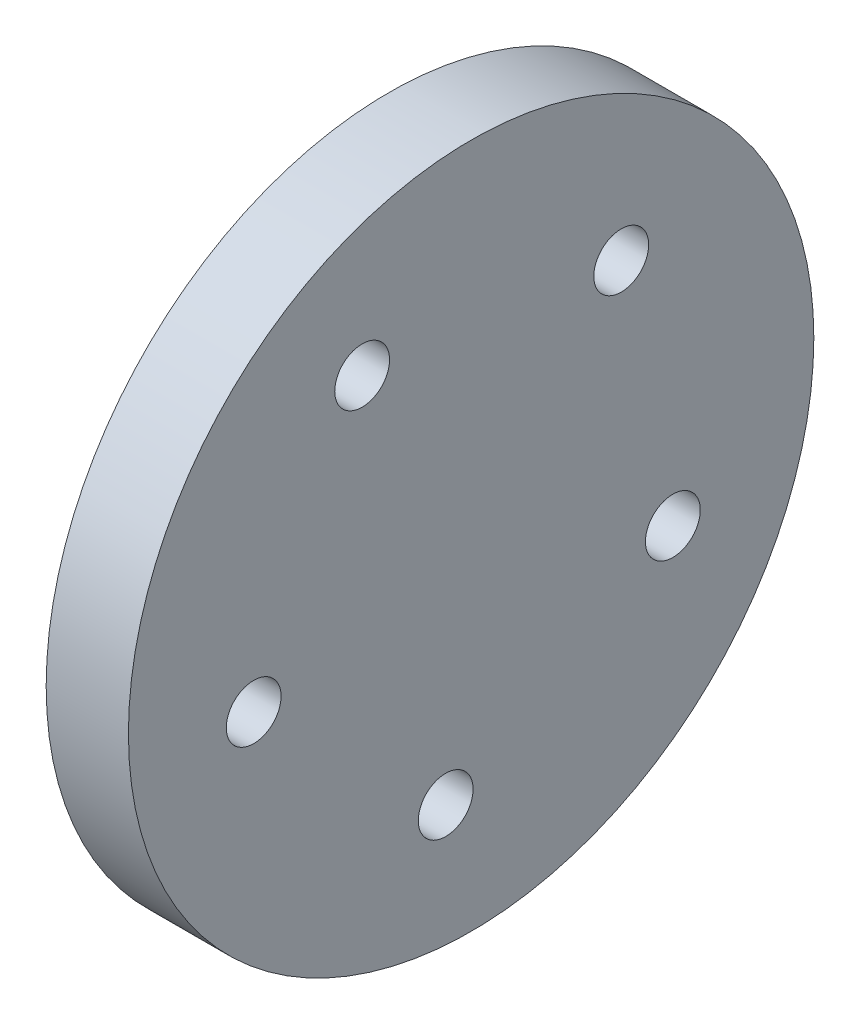
ISO-10303-21;
HEADER;
FILE_DESCRIPTION(('STEP AP214'),'2;1');
FILE_NAME('part.step','',(''),(''),'','','');
FILE_SCHEMA(('AUTOMOTIVE_DESIGN { 1 0 10303 214 1 1 1 1 }'));
ENDSEC;
DATA;
#1=APPLICATION_CONTEXT('core data for automotive mechanical design processes');
#2=APPLICATION_PROTOCOL_DEFINITION('international standard','automotive_design',2000,#1);
#3=PRODUCT_CONTEXT('',#1,'mechanical');
#4=PRODUCT('Part','Part','',(#3));
#5=PRODUCT_RELATED_PRODUCT_CATEGORY('part','',(#4));
#6=PRODUCT_DEFINITION_FORMATION('','',#4);
#7=PRODUCT_DEFINITION_CONTEXT('part definition',#1,'design');
#8=PRODUCT_DEFINITION('design','',#6,#7);
#9=PRODUCT_DEFINITION_SHAPE('','',#8);
#10=(LENGTH_UNIT() NAMED_UNIT(*) SI_UNIT(.MILLI.,.METRE.));
#11=(NAMED_UNIT(*) PLANE_ANGLE_UNIT() SI_UNIT($,.RADIAN.));
#12=(NAMED_UNIT(*) SI_UNIT($,.STERADIAN.) SOLID_ANGLE_UNIT());
#13=UNCERTAINTY_MEASURE_WITH_UNIT(LENGTH_MEASURE(1.E-05),#10,'distance_accuracy_value','');
#14=(GEOMETRIC_REPRESENTATION_CONTEXT(3) GLOBAL_UNCERTAINTY_ASSIGNED_CONTEXT((#13)) GLOBAL_UNIT_ASSIGNED_CONTEXT((#10,
#11,#12)) REPRESENTATION_CONTEXT('',''));
#15=CARTESIAN_POINT('',(0.,0.,0.));
#16=DIRECTION('',(0.,0.,1.));
#17=DIRECTION('',(1.,0.,0.));
#18=AXIS2_PLACEMENT_3D('',#15,#16,#17);
#19=CARTESIAN_POINT('',(5.715,0.,0.));
#20=DIRECTION('',(-1.,0.,0.));
#21=DIRECTION('',(0.,0.,1.));
#22=AXIS2_PLACEMENT_3D('',#19,#20,#21);
#23=CYLINDRICAL_SURFACE('',#22,23.8125);
#24=CARTESIAN_POINT('',(5.715,0.,0.));
#25=DIRECTION('',(1.,0.,0.));
#26=DIRECTION('',(0.,0.,-1.));
#27=AXIS2_PLACEMENT_3D('',#24,#25,#26);
#28=CIRCLE('',#27,23.8125);
#29=CARTESIAN_POINT('',(5.715,0.,-23.8125));
#30=VERTEX_POINT('',#29);
#31=EDGE_CURVE('E10',#30,#30,#28,.T.);
#32=ORIENTED_EDGE('',*,*,#31,.F.);
#33=EDGE_LOOP('',(#32));
#34=FACE_BOUND('',#33,.T.);
#35=CARTESIAN_POINT('',(0.,0.,0.));
#36=DIRECTION('',(1.,0.,0.));
#37=DIRECTION('',(0.,0.,-1.));
#38=AXIS2_PLACEMENT_3D('',#35,#36,#37);
#39=CIRCLE('',#38,23.8125);
#40=CARTESIAN_POINT('',(0.,0.,-23.8125));
#41=VERTEX_POINT('',#40);
#42=EDGE_CURVE('E40',#41,#41,#39,.T.);
#43=ORIENTED_EDGE('',*,*,#42,.T.);
#44=EDGE_LOOP('',(#43));
#45=FACE_BOUND('',#44,.T.);
#46=ADVANCED_FACE('F37',(#34,#45),#23,.T.);
#47=CARTESIAN_POINT('',(5.715,0.,0.));
#48=DIRECTION('',(1.,0.,0.));
#49=DIRECTION('',(0.,0.,-1.));
#50=AXIS2_PLACEMENT_3D('',#47,#48,#49);
#51=PLANE('',#50);
#52=CARTESIAN_POINT('',(5.715,-6.41170861019328,-14.0170590988859));
#53=DIRECTION('',(-1.,0.,0.));
#54=DIRECTION('',(0.,0.,1.));
#55=AXIS2_PLACEMENT_3D('',#52,#53,#54);
#56=CIRCLE('',#55,1.90500000000031);
#57=CARTESIAN_POINT('',(5.715,-6.41170861019328,-12.1120590988856));
#58=VERTEX_POINT('',#57);
#59=EDGE_CURVE('E71',#58,#58,#56,.T.);
#60=ORIENTED_EDGE('',*,*,#59,.T.);
#61=EDGE_LOOP('',(#60));
#62=FACE_BOUND('',#61,.T.);
#63=CARTESIAN_POINT('',(5.715,-15.3123423188197,1.7663877815971));
#64=DIRECTION('',(-1.,0.,0.));
#65=DIRECTION('',(0.,0.,1.));
#66=AXIS2_PLACEMENT_3D('',#63,#64,#65);
#67=CIRCLE('',#66,1.90500000000103);
#68=CARTESIAN_POINT('',(5.715,-15.3123423188197,3.67138778159814));
#69=VERTEX_POINT('',#68);
#70=EDGE_CURVE('E79',#69,#69,#67,.T.);
#71=ORIENTED_EDGE('',*,*,#70,.T.);
#72=EDGE_LOOP('',(#71));
#73=FACE_BOUND('',#72,.T.);
#74=CARTESIAN_POINT('',(5.715,-3.05183939021008,15.1087467852261));
#75=DIRECTION('',(-1.,0.,0.));
#76=DIRECTION('',(0.,0.,1.));
#77=AXIS2_PLACEMENT_3D('',#74,#75,#76);
#78=CIRCLE('',#77,1.90500000000132);
#79=CARTESIAN_POINT('',(5.715,-3.05183939021008,17.0137467852274));
#80=VERTEX_POINT('',#79);
#81=EDGE_CURVE('E87',#80,#80,#78,.T.);
#82=ORIENTED_EDGE('',*,*,#81,.T.);
#83=EDGE_LOOP('',(#82));
#84=FACE_BOUND('',#83,.T.);
#85=CARTESIAN_POINT('',(5.715,13.4262018474648,7.57133125908899));
#86=DIRECTION('',(-1.,0.,0.));
#87=DIRECTION('',(0.,0.,1.));
#88=AXIS2_PLACEMENT_3D('',#85,#86,#87);
#89=CIRCLE('',#88,1.90500000000072);
#90=CARTESIAN_POINT('',(5.715,13.4262018474648,9.47633125908971));
#91=VERTEX_POINT('',#90);
#92=EDGE_CURVE('E63',#91,#91,#89,.T.);
#93=ORIENTED_EDGE('',*,*,#92,.T.);
#94=EDGE_LOOP('',(#93));
#95=FACE_BOUND('',#94,.T.);
#96=CARTESIAN_POINT('',(5.715,11.3496884717605,-10.4294067270239));
#97=DIRECTION('',(-1.,0.,0.));
#98=DIRECTION('',(0.,0.,1.));
#99=AXIS2_PLACEMENT_3D('',#96,#97,#98);
#100=CIRCLE('',#99,1.905);
#101=CARTESIAN_POINT('',(5.715,11.3496884717605,-8.52440672702386));
#102=VERTEX_POINT('',#101);
#103=EDGE_CURVE('E55',#102,#102,#100,.T.);
#104=ORIENTED_EDGE('',*,*,#103,.T.);
#105=EDGE_LOOP('',(#104));
#106=FACE_BOUND('',#105,.T.);
#107=ORIENTED_EDGE('',*,*,#31,.T.);
#108=EDGE_LOOP('',(#107));
#109=FACE_BOUND('',#108,.T.);
#110=ADVANCED_FACE('F99',(#62,#73,#84,#95,#106,#109),#51,.T.);
#111=CARTESIAN_POINT('',(0.,0.,0.));
#112=DIRECTION('',(1.,0.,0.));
#113=DIRECTION('',(0.,0.,-1.));
#114=AXIS2_PLACEMENT_3D('',#111,#112,#113);
#115=PLANE('',#114);
#116=CARTESIAN_POINT('',(0.,-6.41170861019328,-14.0170590988859));
#117=DIRECTION('',(-1.,0.,0.));
#118=DIRECTION('',(0.,0.,1.));
#119=AXIS2_PLACEMENT_3D('',#116,#117,#118);
#120=CIRCLE('',#119,1.90500000000031);
#121=CARTESIAN_POINT('',(0.,-6.41170861019328,-12.1120590988856));
#122=VERTEX_POINT('',#121);
#123=EDGE_CURVE('E67',#122,#122,#120,.T.);
#124=ORIENTED_EDGE('',*,*,#123,.F.);
#125=EDGE_LOOP('',(#124));
#126=FACE_BOUND('',#125,.T.);
#127=CARTESIAN_POINT('',(0.,-15.3123423188197,1.7663877815971));
#128=DIRECTION('',(-1.,0.,0.));
#129=DIRECTION('',(0.,0.,1.));
#130=AXIS2_PLACEMENT_3D('',#127,#128,#129);
#131=CIRCLE('',#130,1.90500000000103);
#132=CARTESIAN_POINT('',(0.,-15.3123423188197,3.67138778159814));
#133=VERTEX_POINT('',#132);
#134=EDGE_CURVE('E75',#133,#133,#131,.T.);
#135=ORIENTED_EDGE('',*,*,#134,.F.);
#136=EDGE_LOOP('',(#135));
#137=FACE_BOUND('',#136,.T.);
#138=CARTESIAN_POINT('',(0.,-3.05183939021008,15.1087467852261));
#139=DIRECTION('',(-1.,0.,0.));
#140=DIRECTION('',(0.,0.,1.));
#141=AXIS2_PLACEMENT_3D('',#138,#139,#140);
#142=CIRCLE('',#141,1.90500000000132);
#143=CARTESIAN_POINT('',(0.,-3.05183939021008,17.0137467852274));
#144=VERTEX_POINT('',#143);
#145=EDGE_CURVE('E83',#144,#144,#142,.T.);
#146=ORIENTED_EDGE('',*,*,#145,.F.);
#147=EDGE_LOOP('',(#146));
#148=FACE_BOUND('',#147,.T.);
#149=CARTESIAN_POINT('',(0.,13.4262018474648,7.57133125908899));
#150=DIRECTION('',(-1.,0.,0.));
#151=DIRECTION('',(0.,0.,1.));
#152=AXIS2_PLACEMENT_3D('',#149,#150,#151);
#153=CIRCLE('',#152,1.90500000000072);
#154=CARTESIAN_POINT('',(0.,13.4262018474648,9.47633125908971));
#155=VERTEX_POINT('',#154);
#156=EDGE_CURVE('E91',#155,#155,#153,.T.);
#157=ORIENTED_EDGE('',*,*,#156,.F.);
#158=EDGE_LOOP('',(#157));
#159=FACE_BOUND('',#158,.T.);
#160=CARTESIAN_POINT('',(0.,11.3496884717605,-10.4294067270239));
#161=DIRECTION('',(-1.,0.,0.));
#162=DIRECTION('',(0.,0.,1.));
#163=AXIS2_PLACEMENT_3D('',#160,#161,#162);
#164=CIRCLE('',#163,1.905);
#165=CARTESIAN_POINT('',(0.,11.3496884717605,-8.52440672702386));
#166=VERTEX_POINT('',#165);
#167=EDGE_CURVE('E59',#166,#166,#164,.T.);
#168=ORIENTED_EDGE('',*,*,#167,.F.);
#169=EDGE_LOOP('',(#168));
#170=FACE_BOUND('',#169,.T.);
#171=CARTESIAN_POINT('',(0.,0.,0.));
#172=DIRECTION('',(1.,0.,0.));
#173=DIRECTION('',(0.,0.,-1.));
#174=AXIS2_PLACEMENT_3D('',#171,#172,#173);
#175=CIRCLE('',#174,2.8);
#176=CARTESIAN_POINT('',(0.,0.,-2.8));
#177=VERTEX_POINT('',#176);
#178=EDGE_CURVE('E51',#177,#177,#175,.T.);
#179=ORIENTED_EDGE('',*,*,#178,.T.);
#180=EDGE_LOOP('',(#179));
#181=FACE_BOUND('',#180,.T.);
#182=ORIENTED_EDGE('',*,*,#42,.F.);
#183=EDGE_LOOP('',(#182));
#184=FACE_BOUND('',#183,.T.);
#185=ADVANCED_FACE('F110',(#126,#137,#148,#159,#170,#181,#184),#115,.F.);
#186=CARTESIAN_POINT('',(3.4544,0.,0.));
#187=DIRECTION('',(-1.,0.,0.));
#188=DIRECTION('',(0.,0.,1.));
#189=AXIS2_PLACEMENT_3D('',#186,#187,#188);
#190=CYLINDRICAL_SURFACE('',#189,2.8);
#191=CARTESIAN_POINT('',(3.4544,0.,0.));
#192=DIRECTION('',(1.,0.,0.));
#193=DIRECTION('',(0.,0.,-1.));
#194=AXIS2_PLACEMENT_3D('',#191,#192,#193);
#195=CIRCLE('',#194,2.8);
#196=CARTESIAN_POINT('',(3.4544,0.,-2.8));
#197=VERTEX_POINT('',#196);
#198=EDGE_CURVE('E49',#197,#197,#195,.T.);
#199=ORIENTED_EDGE('',*,*,#198,.T.);
#200=EDGE_LOOP('',(#199));
#201=FACE_BOUND('',#200,.T.);
#202=ORIENTED_EDGE('',*,*,#178,.F.);
#203=EDGE_LOOP('',(#202));
#204=FACE_BOUND('',#203,.T.);
#205=ADVANCED_FACE('F113',(#201,#204),#190,.F.);
#206=CARTESIAN_POINT('',(3.4544,0.,0.));
#207=DIRECTION('',(1.,0.,0.));
#208=DIRECTION('',(0.,0.,-1.));
#209=AXIS2_PLACEMENT_3D('',#206,#207,#208);
#210=PLANE('',#209);
#211=ORIENTED_EDGE('',*,*,#198,.F.);
#212=EDGE_LOOP('',(#211));
#213=FACE_BOUND('',#212,.T.);
#214=ADVANCED_FACE('F134',(#213),#210,.F.);
#215=CARTESIAN_POINT('',(5.715,11.3496884717605,-10.4294067270239));
#216=DIRECTION('',(-1.,0.,0.));
#217=DIRECTION('',(0.,0.,1.));
#218=AXIS2_PLACEMENT_3D('',#215,#216,#217);
#219=CYLINDRICAL_SURFACE('',#218,1.905);
#220=ORIENTED_EDGE('',*,*,#103,.F.);
#221=EDGE_LOOP('',(#220));
#222=FACE_BOUND('',#221,.T.);
#223=ORIENTED_EDGE('',*,*,#167,.T.);
#224=EDGE_LOOP('',(#223));
#225=FACE_BOUND('',#224,.T.);
#226=ADVANCED_FACE('F106',(#222,#225),#219,.F.);
#227=CARTESIAN_POINT('',(5.715,13.4262018474648,7.57133125908899));
#228=DIRECTION('',(-1.,0.,0.));
#229=DIRECTION('',(0.,0.,1.));
#230=AXIS2_PLACEMENT_3D('',#227,#228,#229);
#231=CYLINDRICAL_SURFACE('',#230,1.90500000000072);
#232=ORIENTED_EDGE('',*,*,#92,.F.);
#233=EDGE_LOOP('',(#232));
#234=FACE_BOUND('',#233,.T.);
#235=ORIENTED_EDGE('',*,*,#156,.T.);
#236=EDGE_LOOP('',(#235));
#237=FACE_BOUND('',#236,.T.);
#238=ADVANCED_FACE('F102',(#234,#237),#231,.F.);
#239=CARTESIAN_POINT('',(5.715,-3.05183939021008,15.1087467852261));
#240=DIRECTION('',(-1.,0.,0.));
#241=DIRECTION('',(0.,0.,1.));
#242=AXIS2_PLACEMENT_3D('',#239,#240,#241);
#243=CYLINDRICAL_SURFACE('',#242,1.90500000000132);
#244=ORIENTED_EDGE('',*,*,#81,.F.);
#245=EDGE_LOOP('',(#244));
#246=FACE_BOUND('',#245,.T.);
#247=ORIENTED_EDGE('',*,*,#145,.T.);
#248=EDGE_LOOP('',(#247));
#249=FACE_BOUND('',#248,.T.);
#250=ADVANCED_FACE('F105',(#246,#249),#243,.F.);
#251=CARTESIAN_POINT('',(5.715,-15.3123423188197,1.7663877815971));
#252=DIRECTION('',(-1.,0.,0.));
#253=DIRECTION('',(0.,0.,1.));
#254=AXIS2_PLACEMENT_3D('',#251,#252,#253);
#255=CYLINDRICAL_SURFACE('',#254,1.90500000000103);
#256=ORIENTED_EDGE('',*,*,#70,.F.);
#257=EDGE_LOOP('',(#256));
#258=FACE_BOUND('',#257,.T.);
#259=ORIENTED_EDGE('',*,*,#134,.T.);
#260=EDGE_LOOP('',(#259));
#261=FACE_BOUND('',#260,.T.);
#262=ADVANCED_FACE('F145',(#258,#261),#255,.F.);
#263=CARTESIAN_POINT('',(5.715,-6.41170861019328,-14.0170590988859));
#264=DIRECTION('',(-1.,0.,0.));
#265=DIRECTION('',(0.,0.,1.));
#266=AXIS2_PLACEMENT_3D('',#263,#264,#265);
#267=CYLINDRICAL_SURFACE('',#266,1.90500000000031);
#268=ORIENTED_EDGE('',*,*,#59,.F.);
#269=EDGE_LOOP('',(#268));
#270=FACE_BOUND('',#269,.T.);
#271=ORIENTED_EDGE('',*,*,#123,.T.);
#272=EDGE_LOOP('',(#271));
#273=FACE_BOUND('',#272,.T.);
#274=ADVANCED_FACE('F142',(#270,#273),#267,.F.);
#275=CLOSED_SHELL('',(#46,#110,#185,#205,#214,#226,#238,#250,#262,#274));
#276=MANIFOLD_SOLID_BREP('B2',#275);
#277=ADVANCED_BREP_SHAPE_REPRESENTATION('',(#18,#276),#14);
#278=SHAPE_DEFINITION_REPRESENTATION(#9,#277);
ENDSEC;
END-ISO-10303-21;
